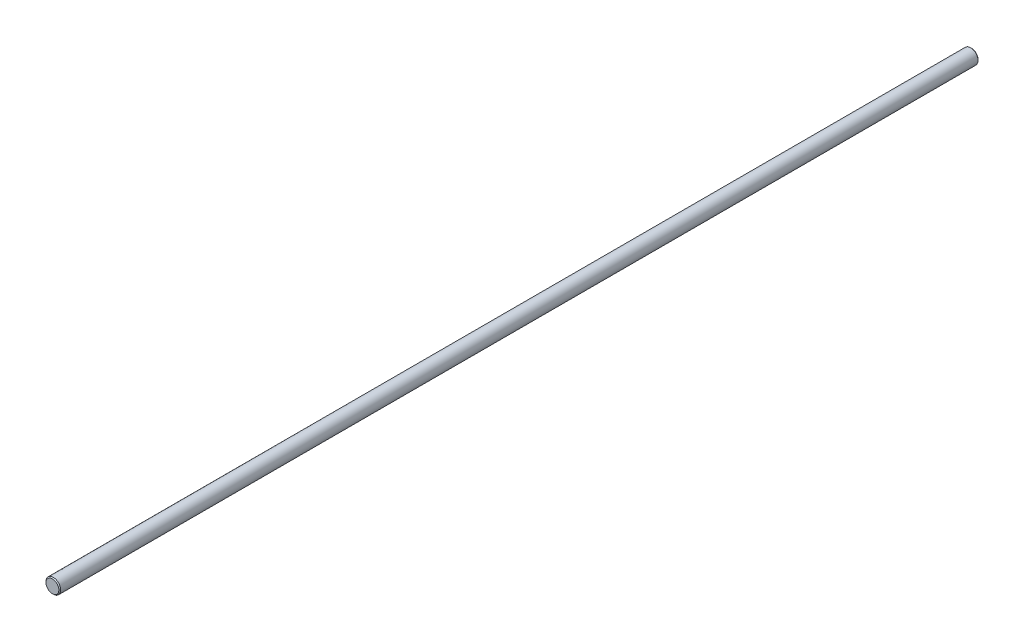
ISO-10303-21;
HEADER;
FILE_DESCRIPTION(('STEP AP214'),'2;1');
FILE_NAME('part.step','',(''),(''),'','','');
FILE_SCHEMA(('AUTOMOTIVE_DESIGN { 1 0 10303 214 1 1 1 1 }'));
ENDSEC;
DATA;
#1=APPLICATION_CONTEXT('core data for automotive mechanical design processes');
#2=APPLICATION_PROTOCOL_DEFINITION('international standard','automotive_design',2000,#1);
#3=PRODUCT_CONTEXT('',#1,'mechanical');
#4=PRODUCT('Part','Part','',(#3));
#5=PRODUCT_RELATED_PRODUCT_CATEGORY('part','',(#4));
#6=PRODUCT_DEFINITION_FORMATION('','',#4);
#7=PRODUCT_DEFINITION_CONTEXT('part definition',#1,'design');
#8=PRODUCT_DEFINITION('design','',#6,#7);
#9=PRODUCT_DEFINITION_SHAPE('','',#8);
#10=(LENGTH_UNIT() NAMED_UNIT(*) SI_UNIT(.MILLI.,.METRE.));
#11=(NAMED_UNIT(*) PLANE_ANGLE_UNIT() SI_UNIT($,.RADIAN.));
#12=(NAMED_UNIT(*) SI_UNIT($,.STERADIAN.) SOLID_ANGLE_UNIT());
#13=UNCERTAINTY_MEASURE_WITH_UNIT(LENGTH_MEASURE(1.E-05),#10,'distance_accuracy_value','');
#14=(GEOMETRIC_REPRESENTATION_CONTEXT(3) GLOBAL_UNCERTAINTY_ASSIGNED_CONTEXT((#13)) GLOBAL_UNIT_ASSIGNED_CONTEXT((#10,
#11,#12)) REPRESENTATION_CONTEXT('',''));
#15=CARTESIAN_POINT('',(0.,0.,0.));
#16=DIRECTION('',(0.,0.,1.));
#17=DIRECTION('',(1.,0.,0.));
#18=AXIS2_PLACEMENT_3D('',#15,#16,#17);
#19=CARTESIAN_POINT('',(0.,0.,-1000.));
#20=DIRECTION('',(0.,0.,1.));
#21=DIRECTION('',(1.,0.,0.));
#22=AXIS2_PLACEMENT_3D('',#19,#20,#21);
#23=CYLINDRICAL_SURFACE('',#22,8.);
#24=CARTESIAN_POINT('',(0.,0.,-999.));
#25=DIRECTION('',(0.,0.,1.));
#26=DIRECTION('',(1.,0.,0.));
#27=AXIS2_PLACEMENT_3D('',#24,#25,#26);
#28=CIRCLE('',#27,8.);
#29=CARTESIAN_POINT('',(8.,0.,-999.));
#30=VERTEX_POINT('',#29);
#31=EDGE_CURVE('E53',#30,#30,#28,.T.);
#32=ORIENTED_EDGE('',*,*,#31,.T.);
#33=EDGE_LOOP('',(#32));
#34=FACE_BOUND('',#33,.T.);
#35=CARTESIAN_POINT('',(0.,0.,-1.00000000000011));
#36=DIRECTION('',(0.,0.,1.));
#37=DIRECTION('',(1.,0.,0.));
#38=AXIS2_PLACEMENT_3D('',#35,#36,#37);
#39=CIRCLE('',#38,8.);
#40=CARTESIAN_POINT('',(8.,0.,-1.00000000000011));
#41=VERTEX_POINT('',#40);
#42=EDGE_CURVE('E58',#41,#41,#39,.F.);
#43=ORIENTED_EDGE('',*,*,#42,.T.);
#44=EDGE_LOOP('',(#43));
#45=FACE_BOUND('',#44,.T.);
#46=ADVANCED_FACE('F39',(#34,#45),#23,.T.);
#47=CARTESIAN_POINT('',(0.,0.,-1000.));
#48=DIRECTION('',(0.,0.,1.));
#49=DIRECTION('',(1.,0.,0.));
#50=AXIS2_PLACEMENT_3D('',#47,#48,#49);
#51=PLANE('',#50);
#52=CARTESIAN_POINT('',(0.,0.,-1000.));
#53=DIRECTION('',(0.,0.,1.));
#54=DIRECTION('',(1.,0.,0.));
#55=AXIS2_PLACEMENT_3D('',#52,#53,#54);
#56=CIRCLE('',#55,7.00000000000001);
#57=CARTESIAN_POINT('',(7.00000000000001,0.,-1000.));
#58=VERTEX_POINT('',#57);
#59=EDGE_CURVE('E48',#58,#58,#56,.F.);
#60=ORIENTED_EDGE('',*,*,#59,.T.);
#61=EDGE_LOOP('',(#60));
#62=FACE_BOUND('',#61,.T.);
#63=ADVANCED_FACE('F75',(#62),#51,.F.);
#64=CARTESIAN_POINT('',(0.,0.,0.));
#65=DIRECTION('',(0.,0.,1.));
#66=DIRECTION('',(1.,0.,0.));
#67=AXIS2_PLACEMENT_3D('',#64,#65,#66);
#68=PLANE('',#67);
#69=CARTESIAN_POINT('',(0.,0.,0.));
#70=DIRECTION('',(0.,0.,1.));
#71=DIRECTION('',(1.,0.,0.));
#72=AXIS2_PLACEMENT_3D('',#69,#70,#71);
#73=CIRCLE('',#72,6.9999999999999);
#74=CARTESIAN_POINT('',(6.9999999999999,0.,0.));
#75=VERTEX_POINT('',#74);
#76=EDGE_CURVE('E10',#75,#75,#73,.T.);
#77=ORIENTED_EDGE('',*,*,#76,.T.);
#78=EDGE_LOOP('',(#77));
#79=FACE_BOUND('',#78,.T.);
#80=ADVANCED_FACE('F72',(#79),#68,.T.);
#81=CARTESIAN_POINT('',(0.,0.,-999.));
#82=DIRECTION('',(0.,0.,1.));
#83=DIRECTION('',(1.,0.,0.));
#84=AXIS2_PLACEMENT_3D('',#81,#82,#83);
#85=CONICAL_SURFACE('',#84,8.,0.7853981633975);
#86=ORIENTED_EDGE('',*,*,#59,.F.);
#87=EDGE_LOOP('',(#86));
#88=FACE_BOUND('',#87,.T.);
#89=ORIENTED_EDGE('',*,*,#31,.F.);
#90=EDGE_LOOP('',(#89));
#91=FACE_BOUND('',#90,.T.);
#92=ADVANCED_FACE('F68',(#88,#91),#85,.T.);
#93=CARTESIAN_POINT('',(0.,0.,0.));
#94=DIRECTION('',(0.,0.,-1.));
#95=DIRECTION('',(-1.,0.,0.));
#96=AXIS2_PLACEMENT_3D('',#93,#94,#95);
#97=CONICAL_SURFACE('',#96,6.9999999999999,0.785398163397445);
#98=ORIENTED_EDGE('',*,*,#42,.F.);
#99=EDGE_LOOP('',(#98));
#100=FACE_BOUND('',#99,.T.);
#101=ORIENTED_EDGE('',*,*,#76,.F.);
#102=EDGE_LOOP('',(#101));
#103=FACE_BOUND('',#102,.T.);
#104=ADVANCED_FACE('F42',(#100,#103),#97,.T.);
#105=CLOSED_SHELL('',(#46,#63,#80,#92,#104));
#106=MANIFOLD_SOLID_BREP('B2',#105);
#107=ADVANCED_BREP_SHAPE_REPRESENTATION('',(#18,#106),#14);
#108=SHAPE_DEFINITION_REPRESENTATION(#9,#107);
ENDSEC;
END-ISO-10303-21;
